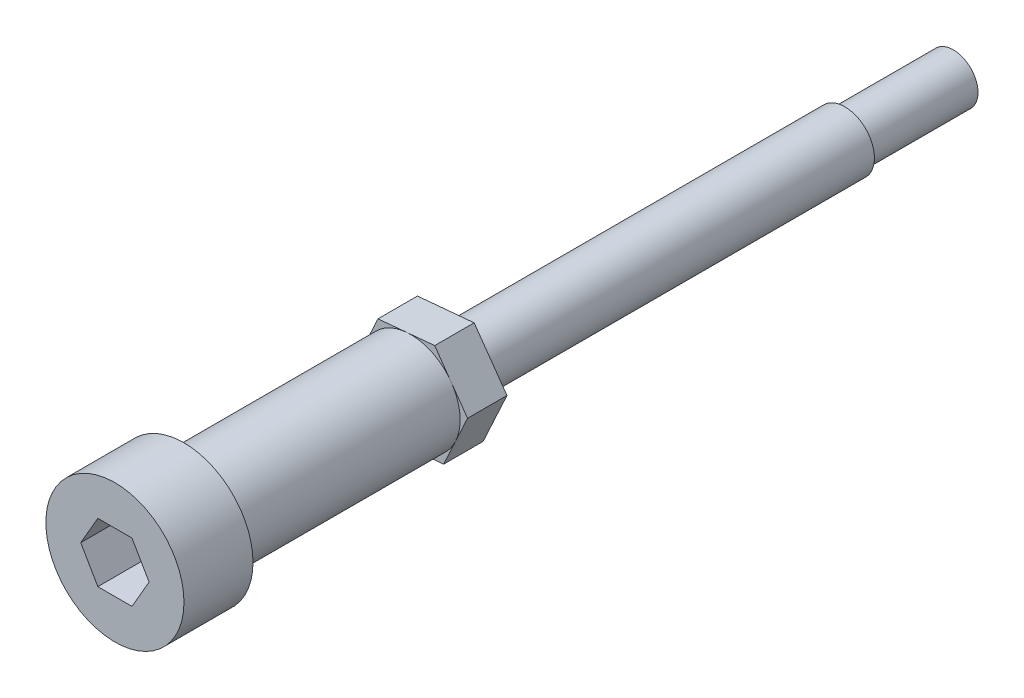
ISO-10303-21;
HEADER;
FILE_DESCRIPTION(('STEP AP214'),'2;1');
FILE_NAME('part.step','',(''),(''),'','','');
FILE_SCHEMA(('AUTOMOTIVE_DESIGN { 1 0 10303 214 1 1 1 1 }'));
ENDSEC;
DATA;
#1=APPLICATION_CONTEXT('core data for automotive mechanical design processes');
#2=APPLICATION_PROTOCOL_DEFINITION('international standard','automotive_design',2000,#1);
#3=PRODUCT_CONTEXT('',#1,'mechanical');
#4=PRODUCT('Part','Part','',(#3));
#5=PRODUCT_RELATED_PRODUCT_CATEGORY('part','',(#4));
#6=PRODUCT_DEFINITION_FORMATION('','',#4);
#7=PRODUCT_DEFINITION_CONTEXT('part definition',#1,'design');
#8=PRODUCT_DEFINITION('design','',#6,#7);
#9=PRODUCT_DEFINITION_SHAPE('','',#8);
#10=(LENGTH_UNIT() NAMED_UNIT(*) SI_UNIT(.MILLI.,.METRE.));
#11=(NAMED_UNIT(*) PLANE_ANGLE_UNIT() SI_UNIT($,.RADIAN.));
#12=(NAMED_UNIT(*) SI_UNIT($,.STERADIAN.) SOLID_ANGLE_UNIT());
#13=UNCERTAINTY_MEASURE_WITH_UNIT(LENGTH_MEASURE(1.E-05),#10,'distance_accuracy_value','');
#14=(GEOMETRIC_REPRESENTATION_CONTEXT(3) GLOBAL_UNCERTAINTY_ASSIGNED_CONTEXT((#13)) GLOBAL_UNIT_ASSIGNED_CONTEXT((#10,
#11,#12)) REPRESENTATION_CONTEXT('',''));
#15=CARTESIAN_POINT('',(0.,0.,0.));
#16=DIRECTION('',(0.,0.,1.));
#17=DIRECTION('',(1.,0.,0.));
#18=AXIS2_PLACEMENT_3D('',#15,#16,#17);
#19=CARTESIAN_POINT('',(0.,0.,0.));
#20=DIRECTION('',(0.,0.,-1.));
#21=DIRECTION('',(-1.,0.,0.));
#22=AXIS2_PLACEMENT_3D('',#19,#20,#21);
#23=PLANE('',#22);
#24=DIRECTION('',(-0.5,0.866025403784439,0.));
#25=VECTOR('',#24,1.);
#26=CARTESIAN_POINT('',(6.92820323027551,0.,0.));
#27=LINE('',#26,#25);
#28=CARTESIAN_POINT('',(6.92820323027551,0.,0.));
#29=VERTEX_POINT('',#28);
#30=CARTESIAN_POINT('',(3.46410161513776,6.,0.));
#31=VERTEX_POINT('',#30);
#32=EDGE_CURVE('E180',#29,#31,#27,.T.);
#33=ORIENTED_EDGE('',*,*,#32,.F.);
#34=DIRECTION('',(0.5,0.866025403784439,0.));
#35=VECTOR('',#34,1.);
#36=CARTESIAN_POINT('',(3.46410161513776,-6.,0.));
#37=LINE('',#36,#35);
#38=CARTESIAN_POINT('',(3.46410161513776,-6.,0.));
#39=VERTEX_POINT('',#38);
#40=EDGE_CURVE('E62',#39,#29,#37,.T.);
#41=ORIENTED_EDGE('',*,*,#40,.F.);
#42=DIRECTION('',(1.,0.,0.));
#43=VECTOR('',#42,1.);
#44=CARTESIAN_POINT('',(-3.46410161513776,-6.,0.));
#45=LINE('',#44,#43);
#46=CARTESIAN_POINT('',(-3.46410161513776,-6.,0.));
#47=VERTEX_POINT('',#46);
#48=EDGE_CURVE('E192',#47,#39,#45,.T.);
#49=ORIENTED_EDGE('',*,*,#48,.F.);
#50=DIRECTION('',(0.5,-0.866025403784439,0.));
#51=VECTOR('',#50,1.);
#52=CARTESIAN_POINT('',(-6.92820323027551,0.,0.));
#53=LINE('',#52,#51);
#54=CARTESIAN_POINT('',(-6.92820323027551,0.,0.));
#55=VERTEX_POINT('',#54);
#56=EDGE_CURVE('E189',#55,#47,#53,.T.);
#57=ORIENTED_EDGE('',*,*,#56,.F.);
#58=DIRECTION('',(-0.5,-0.866025403784439,0.));
#59=VECTOR('',#58,1.);
#60=CARTESIAN_POINT('',(-3.46410161513776,6.,0.));
#61=LINE('',#60,#59);
#62=CARTESIAN_POINT('',(-3.46410161513776,6.,0.));
#63=VERTEX_POINT('',#62);
#64=EDGE_CURVE('E186',#63,#55,#61,.T.);
#65=ORIENTED_EDGE('',*,*,#64,.F.);
#66=DIRECTION('',(-1.,0.,0.));
#67=VECTOR('',#66,1.);
#68=CARTESIAN_POINT('',(3.46410161513776,6.,0.));
#69=LINE('',#68,#67);
#70=EDGE_CURVE('E183',#31,#63,#69,.T.);
#71=ORIENTED_EDGE('',*,*,#70,.F.);
#72=EDGE_LOOP('',(#33,#41,#49,#57,#65,#71));
#73=FACE_BOUND('',#72,.T.);
#74=CARTESIAN_POINT('',(0.,0.,0.));
#75=DIRECTION('',(0.,0.,1.));
#76=DIRECTION('',(1.,0.,0.));
#77=AXIS2_PLACEMENT_3D('',#74,#75,#76);
#78=CIRCLE('',#77,14.);
#79=CARTESIAN_POINT('',(14.,0.,0.));
#80=VERTEX_POINT('',#79);
#81=EDGE_CURVE('E11',#80,#80,#78,.T.);
#82=ORIENTED_EDGE('',*,*,#81,.T.);
#83=EDGE_LOOP('',(#82));
#84=FACE_BOUND('',#83,.T.);
#85=ADVANCED_FACE('F38',(#73,#84),#23,.F.);
#86=CARTESIAN_POINT('',(0.,0.,67.));
#87=DIRECTION('',(0.,0.,1.));
#88=DIRECTION('',(1.,0.,0.));
#89=AXIS2_PLACEMENT_3D('',#86,#87,#88);
#90=CYLINDRICAL_SURFACE('',#89,14.);
#91=ORIENTED_EDGE('',*,*,#81,.F.);
#92=EDGE_LOOP('',(#91));
#93=FACE_BOUND('',#92,.T.);
#94=CARTESIAN_POINT('',(0.,0.,-14.));
#95=DIRECTION('',(0.,0.,1.));
#96=DIRECTION('',(1.,0.,0.));
#97=AXIS2_PLACEMENT_3D('',#94,#95,#96);
#98=CIRCLE('',#97,14.);
#99=CARTESIAN_POINT('',(14.,0.,-14.));
#100=VERTEX_POINT('',#99);
#101=EDGE_CURVE('E47',#100,#100,#98,.T.);
#102=ORIENTED_EDGE('',*,*,#101,.T.);
#103=EDGE_LOOP('',(#102));
#104=FACE_BOUND('',#103,.T.);
#105=ADVANCED_FACE('F243',(#93,#104),#90,.T.);
#106=CARTESIAN_POINT('',(0.,14.,-14.));
#107=DIRECTION('',(0.,0.,1.));
#108=DIRECTION('',(1.,0.,0.));
#109=AXIS2_PLACEMENT_3D('',#106,#107,#108);
#110=PLANE('',#109);
#111=ORIENTED_EDGE('',*,*,#101,.F.);
#112=EDGE_LOOP('',(#111));
#113=FACE_BOUND('',#112,.T.);
#114=CARTESIAN_POINT('',(0.,0.,-14.));
#115=DIRECTION('',(0.,0.,1.));
#116=DIRECTION('',(1.,0.,0.));
#117=AXIS2_PLACEMENT_3D('',#114,#115,#116);
#118=CIRCLE('',#117,10.);
#119=CARTESIAN_POINT('',(10.,0.,-14.));
#120=VERTEX_POINT('',#119);
#121=EDGE_CURVE('E237',#120,#120,#118,.T.);
#122=ORIENTED_EDGE('',*,*,#121,.T.);
#123=EDGE_LOOP('',(#122));
#124=FACE_BOUND('',#123,.T.);
#125=ADVANCED_FACE('F245',(#113,#124),#110,.F.);
#126=CARTESIAN_POINT('',(0.,0.,67.));
#127=DIRECTION('',(0.,0.,1.));
#128=DIRECTION('',(1.,0.,0.));
#129=AXIS2_PLACEMENT_3D('',#126,#127,#128);
#130=CYLINDRICAL_SURFACE('',#129,10.);
#131=ORIENTED_EDGE('',*,*,#121,.F.);
#132=EDGE_LOOP('',(#131));
#133=FACE_BOUND('',#132,.T.);
#134=CARTESIAN_POINT('',(0.,0.,-60.));
#135=DIRECTION('',(0.,0.,1.));
#136=DIRECTION('',(1.,0.,0.));
#137=AXIS2_PLACEMENT_3D('',#134,#135,#136);
#138=CIRCLE('',#137,10.);
#139=CARTESIAN_POINT('',(8.1689471959571,5.76786803850996,-60.));
#140=VERTEX_POINT('',#139);
#141=CARTESIAN_POINT('',(-0.910646649047399,9.95844981312748,-60.));
#142=VERTEX_POINT('',#141);
#143=EDGE_CURVE('E234',#140,#142,#138,.T.);
#144=ORIENTED_EDGE('',*,*,#143,.T.);
#145=CARTESIAN_POINT('',(0.,0.,-60.));
#146=DIRECTION('',(0.,0.,-1.));
#147=DIRECTION('',(-1.,0.,0.));
#148=AXIS2_PLACEMENT_3D('',#145,#146,#147);
#149=CIRCLE('',#148,10.);
#150=CARTESIAN_POINT('',(-9.0795938450045,4.19058177461752,-60.));
#151=VERTEX_POINT('',#150);
#152=EDGE_CURVE('E173',#151,#142,#149,.T.);
#153=ORIENTED_EDGE('',*,*,#152,.F.);
#154=CARTESIAN_POINT('',(-8.1689471959571,-5.76786803850996,-60.));
#155=VERTEX_POINT('',#154);
#156=EDGE_CURVE('E169',#155,#151,#149,.T.);
#157=ORIENTED_EDGE('',*,*,#156,.F.);
#158=CARTESIAN_POINT('',(0.910646649047397,-9.95844981312749,-60.));
#159=VERTEX_POINT('',#158);
#160=EDGE_CURVE('E160',#159,#155,#149,.T.);
#161=ORIENTED_EDGE('',*,*,#160,.F.);
#162=CARTESIAN_POINT('',(9.07959384500449,-4.19058177461752,-60.));
#163=VERTEX_POINT('',#162);
#164=EDGE_CURVE('E323',#163,#159,#149,.T.);
#165=ORIENTED_EDGE('',*,*,#164,.F.);
#166=EDGE_CURVE('E259',#140,#163,#149,.T.);
#167=ORIENTED_EDGE('',*,*,#166,.F.);
#168=EDGE_LOOP('',(#144,#153,#157,#161,#165,#167));
#169=FACE_BOUND('',#168,.T.);
#170=ADVANCED_FACE('F248',(#133,#169),#130,.T.);
#171=CARTESIAN_POINT('',(3.46410161513776,-6.,-10.));
#172=DIRECTION('',(0.866025403784439,-0.5,0.));
#173=DIRECTION('',(0.5,0.866025403784439,0.));
#174=AXIS2_PLACEMENT_3D('',#171,#172,#173);
#175=PLANE('',#174);
#176=ORIENTED_EDGE('',*,*,#40,.T.);
#177=DIRECTION('',(0.,0.,1.));
#178=VECTOR('',#177,1.);
#179=CARTESIAN_POINT('',(6.92820323027551,0.,-10.));
#180=LINE('',#179,#178);
#181=CARTESIAN_POINT('',(6.92820323027551,0.,-10.));
#182=VERTEX_POINT('',#181);
#183=EDGE_CURVE('E213',#182,#29,#180,.T.);
#184=ORIENTED_EDGE('',*,*,#183,.F.);
#185=DIRECTION('',(0.5,0.866025403784439,0.));
#186=VECTOR('',#185,1.);
#187=CARTESIAN_POINT('',(3.46410161513776,-6.,-10.));
#188=LINE('',#187,#186);
#189=CARTESIAN_POINT('',(3.46410161513776,-6.,-10.));
#190=VERTEX_POINT('',#189);
#191=EDGE_CURVE('E195',#190,#182,#188,.T.);
#192=ORIENTED_EDGE('',*,*,#191,.F.);
#193=DIRECTION('',(0.,0.,1.));
#194=VECTOR('',#193,1.);
#195=CARTESIAN_POINT('',(3.46410161513776,-6.,-10.));
#196=LINE('',#195,#194);
#197=EDGE_CURVE('E214',#190,#39,#196,.T.);
#198=ORIENTED_EDGE('',*,*,#197,.T.);
#199=EDGE_LOOP('',(#176,#184,#192,#198));
#200=FACE_BOUND('',#199,.T.);
#201=ADVANCED_FACE('F254',(#200),#175,.F.);
#202=CARTESIAN_POINT('',(-3.46410161513776,-6.,-10.));
#203=DIRECTION('',(0.,-1.,0.));
#204=DIRECTION('',(1.,0.,0.));
#205=AXIS2_PLACEMENT_3D('',#202,#203,#204);
#206=PLANE('',#205);
#207=ORIENTED_EDGE('',*,*,#48,.T.);
#208=ORIENTED_EDGE('',*,*,#197,.F.);
#209=DIRECTION('',(1.,0.,0.));
#210=VECTOR('',#209,1.);
#211=CARTESIAN_POINT('',(-3.46410161513776,-6.,-10.));
#212=LINE('',#211,#210);
#213=CARTESIAN_POINT('',(-3.46410161513776,-6.,-10.));
#214=VERTEX_POINT('',#213);
#215=EDGE_CURVE('E210',#214,#190,#212,.T.);
#216=ORIENTED_EDGE('',*,*,#215,.F.);
#217=DIRECTION('',(0.,0.,1.));
#218=VECTOR('',#217,1.);
#219=CARTESIAN_POINT('',(-3.46410161513776,-6.,-10.));
#220=LINE('',#219,#218);
#221=EDGE_CURVE('E217',#214,#47,#220,.T.);
#222=ORIENTED_EDGE('',*,*,#221,.T.);
#223=EDGE_LOOP('',(#207,#208,#216,#222));
#224=FACE_BOUND('',#223,.T.);
#225=ADVANCED_FACE('F364',(#224),#206,.F.);
#226=CARTESIAN_POINT('',(-6.92820323027551,0.,-10.));
#227=DIRECTION('',(-0.866025403784439,-0.5,0.));
#228=DIRECTION('',(0.5,-0.866025403784439,0.));
#229=AXIS2_PLACEMENT_3D('',#226,#227,#228);
#230=PLANE('',#229);
#231=ORIENTED_EDGE('',*,*,#56,.T.);
#232=ORIENTED_EDGE('',*,*,#221,.F.);
#233=DIRECTION('',(0.5,-0.866025403784439,0.));
#234=VECTOR('',#233,1.);
#235=CARTESIAN_POINT('',(-6.92820323027551,0.,-10.));
#236=LINE('',#235,#234);
#237=CARTESIAN_POINT('',(-6.92820323027551,0.,-10.));
#238=VERTEX_POINT('',#237);
#239=EDGE_CURVE('E207',#238,#214,#236,.T.);
#240=ORIENTED_EDGE('',*,*,#239,.F.);
#241=DIRECTION('',(0.,0.,1.));
#242=VECTOR('',#241,1.);
#243=CARTESIAN_POINT('',(-6.92820323027551,0.,-10.));
#244=LINE('',#243,#242);
#245=EDGE_CURVE('E219',#238,#55,#244,.T.);
#246=ORIENTED_EDGE('',*,*,#245,.T.);
#247=EDGE_LOOP('',(#231,#232,#240,#246));
#248=FACE_BOUND('',#247,.T.);
#249=ADVANCED_FACE('F367',(#248),#230,.F.);
#250=CARTESIAN_POINT('',(-3.46410161513776,6.,-10.));
#251=DIRECTION('',(-0.866025403784439,0.5,0.));
#252=DIRECTION('',(-0.5,-0.866025403784439,0.));
#253=AXIS2_PLACEMENT_3D('',#250,#251,#252);
#254=PLANE('',#253);
#255=ORIENTED_EDGE('',*,*,#64,.T.);
#256=ORIENTED_EDGE('',*,*,#245,.F.);
#257=DIRECTION('',(-0.5,-0.866025403784439,0.));
#258=VECTOR('',#257,1.);
#259=CARTESIAN_POINT('',(-3.46410161513776,6.,-10.));
#260=LINE('',#259,#258);
#261=CARTESIAN_POINT('',(-3.46410161513776,6.,-10.));
#262=VERTEX_POINT('',#261);
#263=EDGE_CURVE('E204',#262,#238,#260,.T.);
#264=ORIENTED_EDGE('',*,*,#263,.F.);
#265=DIRECTION('',(0.,0.,1.));
#266=VECTOR('',#265,1.);
#267=CARTESIAN_POINT('',(-3.46410161513776,6.,-10.));
#268=LINE('',#267,#266);
#269=EDGE_CURVE('E221',#262,#63,#268,.T.);
#270=ORIENTED_EDGE('',*,*,#269,.T.);
#271=EDGE_LOOP('',(#255,#256,#264,#270));
#272=FACE_BOUND('',#271,.T.);
#273=ADVANCED_FACE('F370',(#272),#254,.F.);
#274=CARTESIAN_POINT('',(3.46410161513776,6.,-10.));
#275=DIRECTION('',(0.,1.,0.));
#276=DIRECTION('',(0.,0.,1.));
#277=AXIS2_PLACEMENT_3D('',#274,#275,#276);
#278=PLANE('',#277);
#279=ORIENTED_EDGE('',*,*,#70,.T.);
#280=ORIENTED_EDGE('',*,*,#269,.F.);
#281=DIRECTION('',(-1.,0.,0.));
#282=VECTOR('',#281,1.);
#283=CARTESIAN_POINT('',(3.46410161513776,6.,-10.));
#284=LINE('',#283,#282);
#285=CARTESIAN_POINT('',(3.46410161513776,6.,-10.));
#286=VERTEX_POINT('',#285);
#287=EDGE_CURVE('E201',#286,#262,#284,.T.);
#288=ORIENTED_EDGE('',*,*,#287,.F.);
#289=DIRECTION('',(0.,0.,1.));
#290=VECTOR('',#289,1.);
#291=CARTESIAN_POINT('',(3.46410161513776,6.,-10.));
#292=LINE('',#291,#290);
#293=EDGE_CURVE('E223',#286,#31,#292,.T.);
#294=ORIENTED_EDGE('',*,*,#293,.T.);
#295=EDGE_LOOP('',(#279,#280,#288,#294));
#296=FACE_BOUND('',#295,.T.);
#297=ADVANCED_FACE('F372',(#296),#278,.F.);
#298=CARTESIAN_POINT('',(6.92820323027551,0.,-10.));
#299=DIRECTION('',(0.866025403784439,0.5,0.));
#300=DIRECTION('',(-0.5,0.866025403784439,0.));
#301=AXIS2_PLACEMENT_3D('',#298,#299,#300);
#302=PLANE('',#301);
#303=ORIENTED_EDGE('',*,*,#32,.T.);
#304=ORIENTED_EDGE('',*,*,#293,.F.);
#305=DIRECTION('',(-0.5,0.866025403784439,0.));
#306=VECTOR('',#305,1.);
#307=CARTESIAN_POINT('',(6.92820323027551,0.,-10.));
#308=LINE('',#307,#306);
#309=EDGE_CURVE('E198',#182,#286,#308,.T.);
#310=ORIENTED_EDGE('',*,*,#309,.F.);
#311=ORIENTED_EDGE('',*,*,#183,.T.);
#312=EDGE_LOOP('',(#303,#304,#310,#311));
#313=FACE_BOUND('',#312,.T.);
#314=ADVANCED_FACE('F341',(#313),#302,.F.);
#315=CARTESIAN_POINT('',(3.46410161513776,-6.,-10.));
#316=DIRECTION('',(0.,0.,-1.));
#317=DIRECTION('',(-1.,0.,0.));
#318=AXIS2_PLACEMENT_3D('',#315,#316,#317);
#319=PLANE('',#318);
#320=ORIENTED_EDGE('',*,*,#191,.T.);
#321=ORIENTED_EDGE('',*,*,#309,.T.);
#322=ORIENTED_EDGE('',*,*,#287,.T.);
#323=ORIENTED_EDGE('',*,*,#263,.T.);
#324=ORIENTED_EDGE('',*,*,#239,.T.);
#325=ORIENTED_EDGE('',*,*,#215,.T.);
#326=EDGE_LOOP('',(#320,#321,#322,#323,#324,#325));
#327=FACE_BOUND('',#326,.T.);
#328=ADVANCED_FACE('F333',(#327),#319,.F.);
#329=CARTESIAN_POINT('',(-16.3378943919142,-11.5357360770199,-68.));
#330=DIRECTION('',(0.,0.,-1.));
#331=DIRECTION('',(-1.,0.,0.));
#332=AXIS2_PLACEMENT_3D('',#329,#330,#331);
#333=PLANE('',#332);
#334=DIRECTION('',(-0.995844981312748,-0.0910646649047396,0.));
#335=VECTOR('',#334,1.);
#336=CARTESIAN_POINT('',(6.66016032936793,-9.43268772516334,-68.));
#337=LINE('',#336,#335);
#338=CARTESIAN_POINT('',(6.66016032936793,-9.43268772516334,-68.));
#339=VERTEX_POINT('',#338);
#340=CARTESIAN_POINT('',(-4.83886703127313,-10.4842119010916,-68.));
#341=VERTEX_POINT('',#340);
#342=EDGE_CURVE('E291',#339,#341,#337,.T.);
#343=ORIENTED_EDGE('',*,*,#342,.T.);
#344=DIRECTION('',(-0.576786803850996,0.816894719595709,0.));
#345=VECTOR('',#344,1.);
#346=CARTESIAN_POINT('',(-4.83886703127313,-10.4842119010916,-68.));
#347=LINE('',#346,#345);
#348=CARTESIAN_POINT('',(-11.4990273606411,-1.05152417592829,-68.));
#349=VERTEX_POINT('',#348);
#350=EDGE_CURVE('E167',#341,#349,#347,.T.);
#351=ORIENTED_EDGE('',*,*,#350,.T.);
#352=DIRECTION('',(0.419058177461752,0.907959384500449,0.));
#353=VECTOR('',#352,1.);
#354=CARTESIAN_POINT('',(-11.4990273606411,-1.05152417592829,-68.));
#355=LINE('',#354,#353);
#356=CARTESIAN_POINT('',(-6.66016032936793,9.43268772516333,-68.));
#357=VERTEX_POINT('',#356);
#358=EDGE_CURVE('E294',#349,#357,#355,.T.);
#359=ORIENTED_EDGE('',*,*,#358,.T.);
#360=DIRECTION('',(0.995844981312748,0.0910646649047398,0.));
#361=VECTOR('',#360,1.);
#362=CARTESIAN_POINT('',(-6.66016032936793,9.43268772516333,-68.));
#363=LINE('',#362,#361);
#364=CARTESIAN_POINT('',(4.83886703127313,10.4842119010916,-68.));
#365=VERTEX_POINT('',#364);
#366=EDGE_CURVE('E296',#357,#365,#363,.T.);
#367=ORIENTED_EDGE('',*,*,#366,.T.);
#368=DIRECTION('',(0.576786803850996,-0.816894719595709,0.));
#369=VECTOR('',#368,1.);
#370=CARTESIAN_POINT('',(4.83886703127313,10.4842119010916,-68.));
#371=LINE('',#370,#369);
#372=CARTESIAN_POINT('',(11.4990273606411,1.05152417592829,-68.));
#373=VERTEX_POINT('',#372);
#374=EDGE_CURVE('E298',#365,#373,#371,.T.);
#375=ORIENTED_EDGE('',*,*,#374,.T.);
#376=DIRECTION('',(-0.419058177461752,-0.907959384500449,0.));
#377=VECTOR('',#376,1.);
#378=CARTESIAN_POINT('',(11.4990273606411,1.05152417592829,-68.));
#379=LINE('',#378,#377);
#380=EDGE_CURVE('E300',#373,#339,#379,.T.);
#381=ORIENTED_EDGE('',*,*,#380,.T.);
#382=EDGE_LOOP('',(#343,#351,#359,#367,#375,#381));
#383=FACE_BOUND('',#382,.T.);
#384=CARTESIAN_POINT('',(0.,0.,-68.));
#385=DIRECTION('',(0.,0.,-1.));
#386=DIRECTION('',(-1.,0.,0.));
#387=AXIS2_PLACEMENT_3D('',#384,#385,#386);
#388=CIRCLE('',#387,6.);
#389=CARTESIAN_POINT('',(-6.,0.,-68.));
#390=VERTEX_POINT('',#389);
#391=EDGE_CURVE('E41',#390,#390,#388,.T.);
#392=ORIENTED_EDGE('',*,*,#391,.F.);
#393=EDGE_LOOP('',(#392));
#394=FACE_BOUND('',#393,.T.);
#395=ADVANCED_FACE('F331',(#383,#394),#333,.T.);
#396=CARTESIAN_POINT('',(-16.3378943919142,-11.5357360770199,-60.));
#397=DIRECTION('',(0.,0.,-1.));
#398=DIRECTION('',(-1.,0.,0.));
#399=AXIS2_PLACEMENT_3D('',#396,#397,#398);
#400=PLANE('',#399);
#401=DIRECTION('',(0.419058177461752,0.907959384500449,0.));
#402=VECTOR('',#401,1.);
#403=CARTESIAN_POINT('',(-11.4990273606411,-1.05152417592829,-60.));
#404=LINE('',#403,#402);
#405=CARTESIAN_POINT('',(-6.66016032936793,9.43268772516333,-60.));
#406=VERTEX_POINT('',#405);
#407=EDGE_CURVE('E162',#151,#406,#404,.T.);
#408=ORIENTED_EDGE('',*,*,#407,.F.);
#409=ORIENTED_EDGE('',*,*,#152,.T.);
#410=DIRECTION('',(0.995844981312748,0.0910646649047398,0.));
#411=VECTOR('',#410,1.);
#412=CARTESIAN_POINT('',(-6.66016032936793,9.43268772516333,-60.));
#413=LINE('',#412,#411);
#414=EDGE_CURVE('E279',#406,#142,#413,.T.);
#415=ORIENTED_EDGE('',*,*,#414,.F.);
#416=EDGE_LOOP('',(#408,#409,#415));
#417=FACE_BOUND('',#416,.T.);
#418=ADVANCED_FACE('F316',(#417),#400,.F.);
#419=CARTESIAN_POINT('',(4.83886703127313,10.4842119010916,-60.));
#420=VERTEX_POINT('',#419);
#421=EDGE_CURVE('E267',#142,#420,#413,.T.);
#422=ORIENTED_EDGE('',*,*,#421,.F.);
#423=ORIENTED_EDGE('',*,*,#143,.F.);
#424=DIRECTION('',(0.576786803850996,-0.816894719595709,0.));
#425=VECTOR('',#424,1.);
#426=CARTESIAN_POINT('',(4.83886703127313,10.4842119010916,-60.));
#427=LINE('',#426,#425);
#428=EDGE_CURVE('E266',#420,#140,#427,.T.);
#429=ORIENTED_EDGE('',*,*,#428,.F.);
#430=EDGE_LOOP('',(#422,#423,#429));
#431=FACE_BOUND('',#430,.T.);
#432=ADVANCED_FACE('F264',(#431),#400,.F.);
#433=CARTESIAN_POINT('',(11.4990273606411,1.05152417592829,-60.));
#434=VERTEX_POINT('',#433);
#435=EDGE_CURVE('E271',#140,#434,#427,.T.);
#436=ORIENTED_EDGE('',*,*,#435,.F.);
#437=ORIENTED_EDGE('',*,*,#166,.T.);
#438=DIRECTION('',(-0.419058177461752,-0.907959384500449,0.));
#439=VECTOR('',#438,1.);
#440=CARTESIAN_POINT('',(11.4990273606411,1.05152417592829,-60.));
#441=LINE('',#440,#439);
#442=EDGE_CURVE('E275',#434,#163,#441,.T.);
#443=ORIENTED_EDGE('',*,*,#442,.F.);
#444=EDGE_LOOP('',(#436,#437,#443));
#445=FACE_BOUND('',#444,.T.);
#446=ADVANCED_FACE('F272',(#445),#400,.F.);
#447=CARTESIAN_POINT('',(6.66016032936793,-9.43268772516334,-60.));
#448=VERTEX_POINT('',#447);
#449=EDGE_CURVE('E286',#163,#448,#441,.T.);
#450=ORIENTED_EDGE('',*,*,#449,.F.);
#451=ORIENTED_EDGE('',*,*,#164,.T.);
#452=DIRECTION('',(-0.995844981312748,-0.0910646649047396,0.));
#453=VECTOR('',#452,1.);
#454=CARTESIAN_POINT('',(6.66016032936793,-9.43268772516334,-60.));
#455=LINE('',#454,#453);
#456=EDGE_CURVE('E154',#448,#159,#455,.T.);
#457=ORIENTED_EDGE('',*,*,#456,.F.);
#458=EDGE_LOOP('',(#450,#451,#457));
#459=FACE_BOUND('',#458,.T.);
#460=ADVANCED_FACE('F463',(#459),#400,.F.);
#461=CARTESIAN_POINT('',(-4.83886703127313,-10.4842119010916,-60.));
#462=VERTEX_POINT('',#461);
#463=EDGE_CURVE('E148',#159,#462,#455,.T.);
#464=ORIENTED_EDGE('',*,*,#463,.F.);
#465=ORIENTED_EDGE('',*,*,#160,.T.);
#466=DIRECTION('',(-0.576786803850996,0.816894719595709,0.));
#467=VECTOR('',#466,1.);
#468=CARTESIAN_POINT('',(-4.83886703127313,-10.4842119010916,-60.));
#469=LINE('',#468,#467);
#470=EDGE_CURVE('E54',#462,#155,#469,.T.);
#471=ORIENTED_EDGE('',*,*,#470,.F.);
#472=EDGE_LOOP('',(#464,#465,#471));
#473=FACE_BOUND('',#472,.T.);
#474=ADVANCED_FACE('F159',(#473),#400,.F.);
#475=CARTESIAN_POINT('',(-11.4990273606411,-1.05152417592829,-60.));
#476=VERTEX_POINT('',#475);
#477=EDGE_CURVE('E163',#155,#476,#469,.T.);
#478=ORIENTED_EDGE('',*,*,#477,.F.);
#479=ORIENTED_EDGE('',*,*,#156,.T.);
#480=EDGE_CURVE('E318',#476,#151,#404,.T.);
#481=ORIENTED_EDGE('',*,*,#480,.F.);
#482=EDGE_LOOP('',(#478,#479,#481));
#483=FACE_BOUND('',#482,.T.);
#484=ADVANCED_FACE('F322',(#483),#400,.F.);
#485=CARTESIAN_POINT('',(6.66016032936793,-9.43268772516334,-68.));
#486=DIRECTION('',(-0.0910646649047396,0.995844981312748,0.));
#487=DIRECTION('',(-0.995844981312748,-0.0910646649047396,0.));
#488=AXIS2_PLACEMENT_3D('',#485,#486,#487);
#489=PLANE('',#488);
#490=ORIENTED_EDGE('',*,*,#456,.T.);
#491=ORIENTED_EDGE('',*,*,#463,.T.);
#492=DIRECTION('',(0.,0.,1.));
#493=VECTOR('',#492,1.);
#494=CARTESIAN_POINT('',(-4.83886703127313,-10.4842119010916,-68.));
#495=LINE('',#494,#493);
#496=EDGE_CURVE('E151',#341,#462,#495,.T.);
#497=ORIENTED_EDGE('',*,*,#496,.F.);
#498=ORIENTED_EDGE('',*,*,#342,.F.);
#499=DIRECTION('',(0.,0.,1.));
#500=VECTOR('',#499,1.);
#501=CARTESIAN_POINT('',(6.66016032936793,-9.43268772516334,-68.));
#502=LINE('',#501,#500);
#503=EDGE_CURVE('E302',#339,#448,#502,.T.);
#504=ORIENTED_EDGE('',*,*,#503,.T.);
#505=EDGE_LOOP('',(#490,#491,#497,#498,#504));
#506=FACE_BOUND('',#505,.T.);
#507=ADVANCED_FACE('F149',(#506),#489,.F.);
#508=CARTESIAN_POINT('',(-4.83886703127313,-10.4842119010916,-68.));
#509=DIRECTION('',(0.816894719595709,0.576786803850996,0.));
#510=DIRECTION('',(-0.576786803850996,0.816894719595709,0.));
#511=AXIS2_PLACEMENT_3D('',#508,#509,#510);
#512=PLANE('',#511);
#513=ORIENTED_EDGE('',*,*,#470,.T.);
#514=ORIENTED_EDGE('',*,*,#477,.T.);
#515=DIRECTION('',(0.,0.,1.));
#516=VECTOR('',#515,1.);
#517=CARTESIAN_POINT('',(-11.4990273606411,-1.05152417592829,-68.));
#518=LINE('',#517,#516);
#519=EDGE_CURVE('E170',#349,#476,#518,.T.);
#520=ORIENTED_EDGE('',*,*,#519,.F.);
#521=ORIENTED_EDGE('',*,*,#350,.F.);
#522=ORIENTED_EDGE('',*,*,#496,.T.);
#523=EDGE_LOOP('',(#513,#514,#520,#521,#522));
#524=FACE_BOUND('',#523,.T.);
#525=ADVANCED_FACE('F165',(#524),#512,.F.);
#526=CARTESIAN_POINT('',(-11.4990273606411,-1.05152417592829,-68.));
#527=DIRECTION('',(0.907959384500449,-0.419058177461752,0.));
#528=DIRECTION('',(0.419058177461752,0.907959384500449,0.));
#529=AXIS2_PLACEMENT_3D('',#526,#527,#528);
#530=PLANE('',#529);
#531=ORIENTED_EDGE('',*,*,#480,.T.);
#532=ORIENTED_EDGE('',*,*,#407,.T.);
#533=DIRECTION('',(0.,0.,1.));
#534=VECTOR('',#533,1.);
#535=CARTESIAN_POINT('',(-6.66016032936793,9.43268772516333,-68.));
#536=LINE('',#535,#534);
#537=EDGE_CURVE('E175',#357,#406,#536,.T.);
#538=ORIENTED_EDGE('',*,*,#537,.F.);
#539=ORIENTED_EDGE('',*,*,#358,.F.);
#540=ORIENTED_EDGE('',*,*,#519,.T.);
#541=EDGE_LOOP('',(#531,#532,#538,#539,#540));
#542=FACE_BOUND('',#541,.T.);
#543=ADVANCED_FACE('F321',(#542),#530,.F.);
#544=CARTESIAN_POINT('',(-6.66016032936793,9.43268772516333,-68.));
#545=DIRECTION('',(0.0910646649047398,-0.995844981312748,0.));
#546=DIRECTION('',(0.995844981312748,0.0910646649047398,0.));
#547=AXIS2_PLACEMENT_3D('',#544,#545,#546);
#548=PLANE('',#547);
#549=ORIENTED_EDGE('',*,*,#414,.T.);
#550=ORIENTED_EDGE('',*,*,#421,.T.);
#551=DIRECTION('',(0.,0.,1.));
#552=VECTOR('',#551,1.);
#553=CARTESIAN_POINT('',(4.83886703127313,10.4842119010916,-68.));
#554=LINE('',#553,#552);
#555=EDGE_CURVE('E285',#365,#420,#554,.T.);
#556=ORIENTED_EDGE('',*,*,#555,.F.);
#557=ORIENTED_EDGE('',*,*,#366,.F.);
#558=ORIENTED_EDGE('',*,*,#537,.T.);
#559=EDGE_LOOP('',(#549,#550,#556,#557,#558));
#560=FACE_BOUND('',#559,.T.);
#561=ADVANCED_FACE('F311',(#560),#548,.F.);
#562=CARTESIAN_POINT('',(4.83886703127313,10.4842119010916,-68.));
#563=DIRECTION('',(-0.816894719595709,-0.576786803850996,0.));
#564=DIRECTION('',(0.576786803850996,-0.816894719595709,0.));
#565=AXIS2_PLACEMENT_3D('',#562,#563,#564);
#566=PLANE('',#565);
#567=ORIENTED_EDGE('',*,*,#428,.T.);
#568=ORIENTED_EDGE('',*,*,#435,.T.);
#569=DIRECTION('',(0.,0.,1.));
#570=VECTOR('',#569,1.);
#571=CARTESIAN_POINT('',(11.4990273606411,1.05152417592829,-68.));
#572=LINE('',#571,#570);
#573=EDGE_CURVE('E304',#373,#434,#572,.T.);
#574=ORIENTED_EDGE('',*,*,#573,.F.);
#575=ORIENTED_EDGE('',*,*,#374,.F.);
#576=ORIENTED_EDGE('',*,*,#555,.T.);
#577=EDGE_LOOP('',(#567,#568,#574,#575,#576));
#578=FACE_BOUND('',#577,.T.);
#579=ADVANCED_FACE('F282',(#578),#566,.F.);
#580=CARTESIAN_POINT('',(11.4990273606411,1.05152417592829,-68.));
#581=DIRECTION('',(-0.907959384500449,0.419058177461752,0.));
#582=DIRECTION('',(-0.419058177461752,-0.907959384500449,0.));
#583=AXIS2_PLACEMENT_3D('',#580,#581,#582);
#584=PLANE('',#583);
#585=ORIENTED_EDGE('',*,*,#442,.T.);
#586=ORIENTED_EDGE('',*,*,#449,.T.);
#587=ORIENTED_EDGE('',*,*,#503,.F.);
#588=ORIENTED_EDGE('',*,*,#380,.F.);
#589=ORIENTED_EDGE('',*,*,#573,.T.);
#590=EDGE_LOOP('',(#585,#586,#587,#588,#589));
#591=FACE_BOUND('',#590,.T.);
#592=ADVANCED_FACE('F389',(#591),#584,.F.);
#593=CARTESIAN_POINT('',(0.,5.,-170.));
#594=DIRECTION('',(0.,0.,1.));
#595=DIRECTION('',(1.,0.,0.));
#596=AXIS2_PLACEMENT_3D('',#593,#594,#595);
#597=PLANE('',#596);
#598=CARTESIAN_POINT('',(0.,0.,-170.));
#599=DIRECTION('',(0.,0.,1.));
#600=DIRECTION('',(1.,0.,0.));
#601=AXIS2_PLACEMENT_3D('',#598,#599,#600);
#602=CIRCLE('',#601,5.);
#603=CARTESIAN_POINT('',(5.,0.,-170.));
#604=VERTEX_POINT('',#603);
#605=EDGE_CURVE('E216',#604,#604,#602,.T.);
#606=ORIENTED_EDGE('',*,*,#605,.F.);
#607=EDGE_LOOP('',(#606));
#608=FACE_BOUND('',#607,.T.);
#609=ADVANCED_FACE('F385',(#608),#597,.F.);
#610=CARTESIAN_POINT('',(0.,0.,67.));
#611=DIRECTION('',(0.,0.,1.));
#612=DIRECTION('',(1.,0.,0.));
#613=AXIS2_PLACEMENT_3D('',#610,#611,#612);
#614=CYLINDRICAL_SURFACE('',#613,5.);
#615=CARTESIAN_POINT('',(0.,0.,-148.));
#616=DIRECTION('',(0.,0.,1.));
#617=DIRECTION('',(1.,0.,0.));
#618=AXIS2_PLACEMENT_3D('',#615,#616,#617);
#619=CIRCLE('',#618,5.);
#620=CARTESIAN_POINT('',(5.,0.,-148.));
#621=VERTEX_POINT('',#620);
#622=EDGE_CURVE('E228',#621,#621,#619,.T.);
#623=ORIENTED_EDGE('',*,*,#622,.F.);
#624=EDGE_LOOP('',(#623));
#625=FACE_BOUND('',#624,.T.);
#626=ORIENTED_EDGE('',*,*,#605,.T.);
#627=EDGE_LOOP('',(#626));
#628=FACE_BOUND('',#627,.T.);
#629=ADVANCED_FACE('F388',(#625,#628),#614,.T.);
#630=CARTESIAN_POINT('',(0.,6.,-148.));
#631=DIRECTION('',(0.,0.,1.));
#632=DIRECTION('',(1.,0.,0.));
#633=AXIS2_PLACEMENT_3D('',#630,#631,#632);
#634=PLANE('',#633);
#635=CARTESIAN_POINT('',(0.,0.,-148.));
#636=DIRECTION('',(0.,0.,1.));
#637=DIRECTION('',(1.,0.,0.));
#638=AXIS2_PLACEMENT_3D('',#635,#636,#637);
#639=CIRCLE('',#638,6.);
#640=CARTESIAN_POINT('',(6.,0.,-148.));
#641=VERTEX_POINT('',#640);
#642=EDGE_CURVE('E231',#641,#641,#639,.T.);
#643=ORIENTED_EDGE('',*,*,#642,.F.);
#644=EDGE_LOOP('',(#643));
#645=FACE_BOUND('',#644,.T.);
#646=ORIENTED_EDGE('',*,*,#622,.T.);
#647=EDGE_LOOP('',(#646));
#648=FACE_BOUND('',#647,.T.);
#649=ADVANCED_FACE('F393',(#645,#648),#634,.F.);
#650=CARTESIAN_POINT('',(0.,0.,67.));
#651=DIRECTION('',(0.,0.,1.));
#652=DIRECTION('',(1.,0.,0.));
#653=AXIS2_PLACEMENT_3D('',#650,#651,#652);
#654=CYLINDRICAL_SURFACE('',#653,6.);
#655=ORIENTED_EDGE('',*,*,#391,.T.);
#656=EDGE_LOOP('',(#655));
#657=FACE_BOUND('',#656,.T.);
#658=ORIENTED_EDGE('',*,*,#642,.T.);
#659=EDGE_LOOP('',(#658));
#660=FACE_BOUND('',#659,.T.);
#661=ADVANCED_FACE('F328',(#657,#660),#654,.T.);
#662=CLOSED_SHELL('',(#85,#105,#125,#170,#201,#225,#249,#273,#297,#314,#328,#395,#418,#432,#446,
#460,#474,#484,#507,#525,#543,#561,#579,#592,#609,#629,#649,#661));
#663=MANIFOLD_SOLID_BREP('B2',#662);
#664=ADVANCED_BREP_SHAPE_REPRESENTATION('',(#18,#663),#14);
#665=SHAPE_DEFINITION_REPRESENTATION(#9,#664);
ENDSEC;
END-ISO-10303-21;
